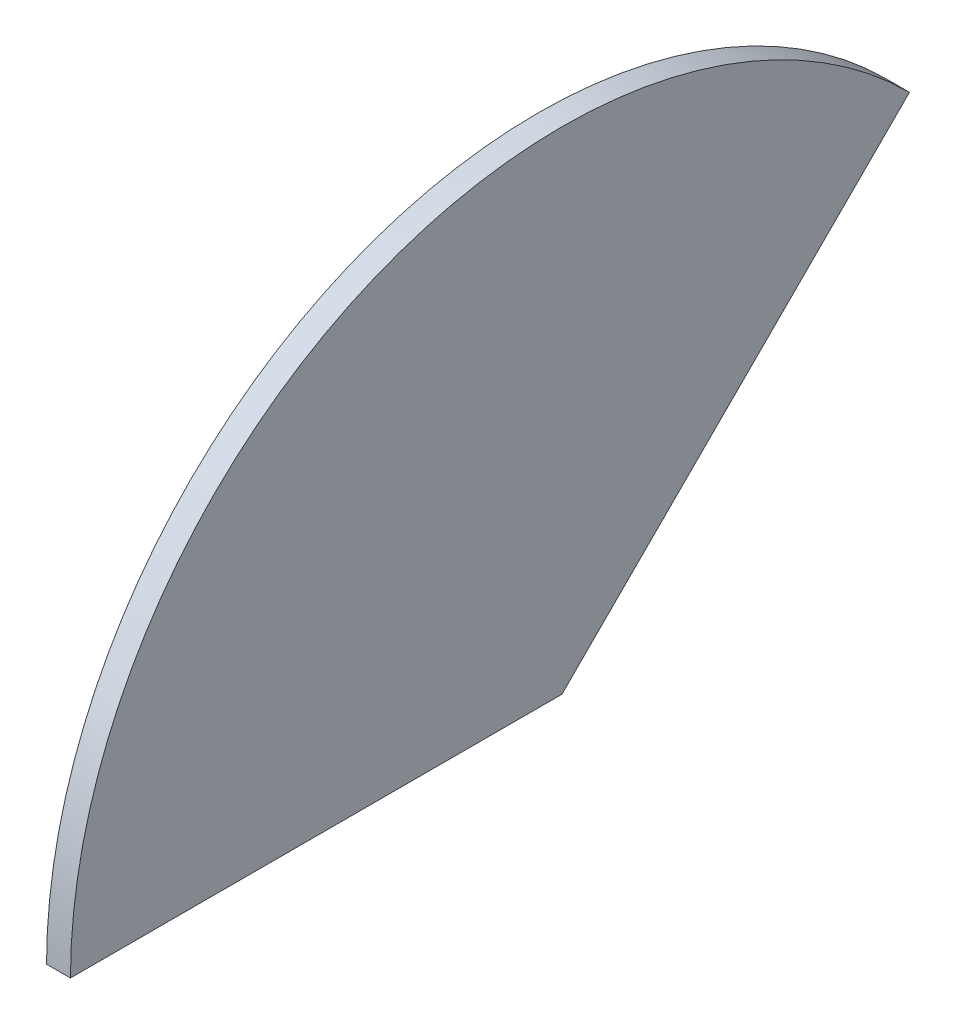
ISO-10303-21;
HEADER;
FILE_DESCRIPTION(('STEP AP214'),'2;1');
FILE_NAME('part.step','',(''),(''),'','','');
FILE_SCHEMA(('AUTOMOTIVE_DESIGN { 1 0 10303 214 1 1 1 1 }'));
ENDSEC;
DATA;
#1=APPLICATION_CONTEXT('core data for automotive mechanical design processes');
#2=APPLICATION_PROTOCOL_DEFINITION('international standard','automotive_design',2000,#1);
#3=PRODUCT_CONTEXT('',#1,'mechanical');
#4=PRODUCT('Part','Part','',(#3));
#5=PRODUCT_RELATED_PRODUCT_CATEGORY('part','',(#4));
#6=PRODUCT_DEFINITION_FORMATION('','',#4);
#7=PRODUCT_DEFINITION_CONTEXT('part definition',#1,'design');
#8=PRODUCT_DEFINITION('design','',#6,#7);
#9=PRODUCT_DEFINITION_SHAPE('','',#8);
#10=(LENGTH_UNIT() NAMED_UNIT(*) SI_UNIT(.MILLI.,.METRE.));
#11=(NAMED_UNIT(*) PLANE_ANGLE_UNIT() SI_UNIT($,.RADIAN.));
#12=(NAMED_UNIT(*) SI_UNIT($,.STERADIAN.) SOLID_ANGLE_UNIT());
#13=UNCERTAINTY_MEASURE_WITH_UNIT(LENGTH_MEASURE(1.E-05),#10,'distance_accuracy_value','');
#14=(GEOMETRIC_REPRESENTATION_CONTEXT(3) GLOBAL_UNCERTAINTY_ASSIGNED_CONTEXT((#13)) GLOBAL_UNIT_ASSIGNED_CONTEXT((#10,
#11,#12)) REPRESENTATION_CONTEXT('',''));
#15=CARTESIAN_POINT('',(0.,0.,0.));
#16=DIRECTION('',(0.,0.,1.));
#17=DIRECTION('',(1.,0.,0.));
#18=AXIS2_PLACEMENT_3D('',#15,#16,#17);
#19=CARTESIAN_POINT('',(9.,0.,0.));
#20=DIRECTION('',(0.,0.707106781186551,0.707106781186544));
#21=DIRECTION('',(0.,-0.707106781186544,0.707106781186551));
#22=AXIS2_PLACEMENT_3D('',#19,#20,#21);
#23=PLANE('',#22);
#24=DIRECTION('',(0.,0.707106781186544,-0.707106781186551));
#25=VECTOR('',#24,1.);
#26=CARTESIAN_POINT('',(0.,0.,0.));
#27=LINE('',#26,#25);
#28=CARTESIAN_POINT('',(0.,0.,0.));
#29=VERTEX_POINT('',#28);
#30=CARTESIAN_POINT('',(0.,130.814754519511,-130.814754519512));
#31=VERTEX_POINT('',#30);
#32=EDGE_CURVE('E93',#29,#31,#27,.T.);
#33=ORIENTED_EDGE('',*,*,#32,.T.);
#34=DIRECTION('',(-1.,0.,0.));
#35=VECTOR('',#34,1.);
#36=CARTESIAN_POINT('',(9.,130.814754519511,-130.814754519512));
#37=LINE('',#36,#35);
#38=CARTESIAN_POINT('',(9.,130.814754519511,-130.814754519512));
#39=VERTEX_POINT('',#38);
#40=EDGE_CURVE('E11',#39,#31,#37,.T.);
#41=ORIENTED_EDGE('',*,*,#40,.F.);
#42=DIRECTION('',(0.,0.707106781186544,-0.707106781186551));
#43=VECTOR('',#42,1.);
#44=CARTESIAN_POINT('',(9.,0.,0.));
#45=LINE('',#44,#43);
#46=CARTESIAN_POINT('',(9.,0.,0.));
#47=VERTEX_POINT('',#46);
#48=EDGE_CURVE('E85',#47,#39,#45,.T.);
#49=ORIENTED_EDGE('',*,*,#48,.F.);
#50=DIRECTION('',(-1.,0.,0.));
#51=VECTOR('',#50,1.);
#52=CARTESIAN_POINT('',(9.,0.,0.));
#53=LINE('',#52,#51);
#54=EDGE_CURVE('E94',#47,#29,#53,.T.);
#55=ORIENTED_EDGE('',*,*,#54,.T.);
#56=EDGE_LOOP('',(#33,#41,#49,#55));
#57=FACE_BOUND('',#56,.T.);
#58=ADVANCED_FACE('F43',(#57),#23,.F.);
#59=CARTESIAN_POINT('',(9.,0.,0.));
#60=DIRECTION('',(-1.,0.,0.));
#61=DIRECTION('',(0.,0.,1.));
#62=AXIS2_PLACEMENT_3D('',#59,#60,#61);
#63=CYLINDRICAL_SURFACE('',#62,185.);
#64=CARTESIAN_POINT('',(0.,0.,0.));
#65=DIRECTION('',(1.,0.,0.));
#66=DIRECTION('',(0.,0.,-1.));
#67=AXIS2_PLACEMENT_3D('',#64,#65,#66);
#68=CIRCLE('',#67,185.);
#69=CARTESIAN_POINT('',(0.,0.,185.));
#70=VERTEX_POINT('',#69);
#71=EDGE_CURVE('E72',#31,#70,#68,.T.);
#72=ORIENTED_EDGE('',*,*,#71,.T.);
#73=DIRECTION('',(-1.,0.,0.));
#74=VECTOR('',#73,1.);
#75=CARTESIAN_POINT('',(9.,0.,185.));
#76=LINE('',#75,#74);
#77=CARTESIAN_POINT('',(9.,0.,185.));
#78=VERTEX_POINT('',#77);
#79=EDGE_CURVE('E52',#78,#70,#76,.T.);
#80=ORIENTED_EDGE('',*,*,#79,.F.);
#81=CARTESIAN_POINT('',(9.,0.,0.));
#82=DIRECTION('',(1.,0.,0.));
#83=DIRECTION('',(0.,0.,-1.));
#84=AXIS2_PLACEMENT_3D('',#81,#82,#83);
#85=CIRCLE('',#84,185.);
#86=EDGE_CURVE('E80',#39,#78,#85,.T.);
#87=ORIENTED_EDGE('',*,*,#86,.F.);
#88=ORIENTED_EDGE('',*,*,#40,.T.);
#89=EDGE_LOOP('',(#72,#80,#87,#88));
#90=FACE_BOUND('',#89,.T.);
#91=ADVANCED_FACE('F81',(#90),#63,.T.);
#92=CARTESIAN_POINT('',(9.,0.,0.));
#93=DIRECTION('',(0.,1.,0.));
#94=DIRECTION('',(0.,0.,1.));
#95=AXIS2_PLACEMENT_3D('',#92,#93,#94);
#96=PLANE('',#95);
#97=DIRECTION('',(0.,0.,-1.));
#98=VECTOR('',#97,1.);
#99=CARTESIAN_POINT('',(0.,0.,0.));
#100=LINE('',#99,#98);
#101=EDGE_CURVE('E77',#70,#29,#100,.T.);
#102=ORIENTED_EDGE('',*,*,#101,.T.);
#103=ORIENTED_EDGE('',*,*,#54,.F.);
#104=DIRECTION('',(0.,0.,-1.));
#105=VECTOR('',#104,1.);
#106=CARTESIAN_POINT('',(9.,0.,0.));
#107=LINE('',#106,#105);
#108=EDGE_CURVE('E60',#78,#47,#107,.T.);
#109=ORIENTED_EDGE('',*,*,#108,.F.);
#110=ORIENTED_EDGE('',*,*,#79,.T.);
#111=EDGE_LOOP('',(#102,#103,#109,#110));
#112=FACE_BOUND('',#111,.T.);
#113=ADVANCED_FACE('F106',(#112),#96,.F.);
#114=CARTESIAN_POINT('',(9.,0.,0.));
#115=DIRECTION('',(1.,0.,0.));
#116=DIRECTION('',(0.,0.,-1.));
#117=AXIS2_PLACEMENT_3D('',#114,#115,#116);
#118=PLANE('',#117);
#119=ORIENTED_EDGE('',*,*,#48,.T.);
#120=ORIENTED_EDGE('',*,*,#86,.T.);
#121=ORIENTED_EDGE('',*,*,#108,.T.);
#122=EDGE_LOOP('',(#119,#120,#121));
#123=FACE_BOUND('',#122,.T.);
#124=ADVANCED_FACE('F88',(#123),#118,.T.);
#125=CARTESIAN_POINT('',(0.,0.,0.));
#126=DIRECTION('',(1.,0.,0.));
#127=DIRECTION('',(0.,0.,-1.));
#128=AXIS2_PLACEMENT_3D('',#125,#126,#127);
#129=PLANE('',#128);
#130=ORIENTED_EDGE('',*,*,#32,.F.);
#131=ORIENTED_EDGE('',*,*,#101,.F.);
#132=ORIENTED_EDGE('',*,*,#71,.F.);
#133=EDGE_LOOP('',(#130,#131,#132));
#134=FACE_BOUND('',#133,.T.);
#135=ADVANCED_FACE('F107',(#134),#129,.F.);
#136=CLOSED_SHELL('',(#58,#91,#113,#124,#135));
#137=MANIFOLD_SOLID_BREP('B2',#136);
#138=ADVANCED_BREP_SHAPE_REPRESENTATION('',(#18,#137),#14);
#139=SHAPE_DEFINITION_REPRESENTATION(#9,#138);
ENDSEC;
END-ISO-10303-21;
